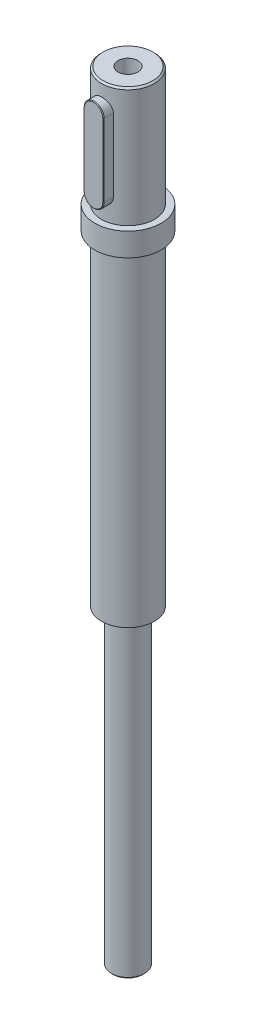
ISO-10303-21;
HEADER;
FILE_DESCRIPTION(('STEP AP214'),'2;1');
FILE_NAME('part.step','',(''),(''),'','','');
FILE_SCHEMA(('AUTOMOTIVE_DESIGN { 1 0 10303 214 1 1 1 1 }'));
ENDSEC;
DATA;
#1=APPLICATION_CONTEXT('core data for automotive mechanical design processes');
#2=APPLICATION_PROTOCOL_DEFINITION('international standard','automotive_design',2000,#1);
#3=PRODUCT_CONTEXT('',#1,'mechanical');
#4=PRODUCT('Part','Part','',(#3));
#5=PRODUCT_RELATED_PRODUCT_CATEGORY('part','',(#4));
#6=PRODUCT_DEFINITION_FORMATION('','',#4);
#7=PRODUCT_DEFINITION_CONTEXT('part definition',#1,'design');
#8=PRODUCT_DEFINITION('design','',#6,#7);
#9=PRODUCT_DEFINITION_SHAPE('','',#8);
#10=(LENGTH_UNIT() NAMED_UNIT(*) SI_UNIT(.MILLI.,.METRE.));
#11=(NAMED_UNIT(*) PLANE_ANGLE_UNIT() SI_UNIT($,.RADIAN.));
#12=(NAMED_UNIT(*) SI_UNIT($,.STERADIAN.) SOLID_ANGLE_UNIT());
#13=UNCERTAINTY_MEASURE_WITH_UNIT(LENGTH_MEASURE(1.E-05),#10,'distance_accuracy_value','');
#14=(GEOMETRIC_REPRESENTATION_CONTEXT(3) GLOBAL_UNCERTAINTY_ASSIGNED_CONTEXT((#13)) GLOBAL_UNIT_ASSIGNED_CONTEXT((#10,
#11,#12)) REPRESENTATION_CONTEXT('',''));
#15=CARTESIAN_POINT('',(0.,0.,0.));
#16=DIRECTION('',(0.,0.,1.));
#17=DIRECTION('',(1.,0.,0.));
#18=AXIS2_PLACEMENT_3D('',#15,#16,#17);
#19=CARTESIAN_POINT('',(0.,117.5,0.));
#20=DIRECTION('',(0.,-1.,0.));
#21=DIRECTION('',(0.,0.,-1.));
#22=AXIS2_PLACEMENT_3D('',#19,#20,#21);
#23=CYLINDRICAL_SURFACE('',#22,4.);
#24=CARTESIAN_POINT('',(0.,117.25,0.));
#25=DIRECTION('',(0.,1.,0.));
#26=DIRECTION('',(0.,0.,1.));
#27=AXIS2_PLACEMENT_3D('',#24,#25,#26);
#28=CIRCLE('',#27,4.);
#29=CARTESIAN_POINT('',(0.,117.25,4.));
#30=VERTEX_POINT('',#29);
#31=EDGE_CURVE('E155',#30,#30,#28,.F.);
#32=ORIENTED_EDGE('',*,*,#31,.T.);
#33=EDGE_LOOP('',(#32));
#34=FACE_BOUND('',#33,.T.);
#35=CARTESIAN_POINT('',(0.,99.5,0.));
#36=DIRECTION('',(0.,1.,0.));
#37=DIRECTION('',(0.,0.,1.));
#38=AXIS2_PLACEMENT_3D('',#35,#36,#37);
#39=CIRCLE('',#38,4.);
#40=CARTESIAN_POINT('',(0.,99.5,4.));
#41=VERTEX_POINT('',#40);
#42=EDGE_CURVE('E113',#41,#41,#39,.T.);
#43=ORIENTED_EDGE('',*,*,#42,.T.);
#44=EDGE_LOOP('',(#43));
#45=FACE_BOUND('',#44,.T.);
#46=CARTESIAN_POINT('',(-1.5,103.,3.70809924354783));
#47=CARTESIAN_POINT('',(-1.50000304106109,102.918992516279,3.70809640633806));
#48=CARTESIAN_POINT('',(-1.49341597549487,102.838005077496,3.71078260240986));
#49=CARTESIAN_POINT('',(-1.46736187895468,102.678471917087,3.72116159304967));
#50=CARTESIAN_POINT('',(-1.44789523373263,102.599926122405,3.72885423767112));
#51=CARTESIAN_POINT('',(-1.39689657610574,102.447624628386,3.748254802809));
#52=CARTESIAN_POINT('',(-1.36539347266348,102.373857943349,3.7599530956926));
#53=CARTESIAN_POINT('',(-1.29131856742698,102.232628103181,3.78603134206598));
#54=CARTESIAN_POINT('',(-1.24874344095039,102.165166849718,3.80041210067323));
#55=CARTESIAN_POINT('',(-1.15146661374163,102.035109688377,3.83103574665712));
#56=CARTESIAN_POINT('',(-1.09630381213307,101.972871470371,3.84733341923603));
#57=CARTESIAN_POINT('',(-0.976395839778934,101.858277185329,3.87949750628547));
#58=CARTESIAN_POINT('',(-0.911648630256685,101.805923226258,3.89536382814785));
#59=CARTESIAN_POINT('',(-0.771694655177602,101.710860487704,3.92552873936553));
#60=CARTESIAN_POINT('',(-0.696206947538028,101.668540525284,3.93975561223505));
#61=CARTESIAN_POINT('',(-0.538555771965246,101.597348827475,3.96438007973847));
#62=CARTESIAN_POINT('',(-0.456394630933535,101.568472428008,3.97477900217006));
#63=CARTESIAN_POINT('',(-0.291489341676831,101.526242104225,3.9901869710344));
#64=CARTESIAN_POINT('',(-0.208923197281596,101.51227237256,3.99540915214774));
#65=CARTESIAN_POINT('',(-0.0424643637947871,101.498278799055,4.0006401410794));
#66=CARTESIAN_POINT('',(0.041427885062831,101.498250422381,4.00065064414902));
#67=CARTESIAN_POINT('',(0.203743543064475,101.511781761465,3.99559265903894));
#68=CARTESIAN_POINT('',(0.2822321782669,101.524669297949,3.99077541996683));
#69=CARTESIAN_POINT('',(0.435839217984393,101.562535915226,3.97693274932263));
#70=CARTESIAN_POINT('',(0.510957383430299,101.587515852262,3.96790701975578));
#71=CARTESIAN_POINT('',(0.656989017303104,101.649170451676,3.94637769167531));
#72=CARTESIAN_POINT('',(0.727825392287309,101.686010005268,3.93382539470077));
#73=CARTESIAN_POINT('',(0.862486607957559,101.770192096929,3.90651310225279));
#74=CARTESIAN_POINT('',(0.926309176932322,101.817538023018,3.8917523951284));
#75=CARTESIAN_POINT('',(1.04909048680093,101.924627286283,3.86052529655816));
#76=CARTESIAN_POINT('',(1.10754614526348,101.98493391565,3.84400963763883));
#77=CARTESIAN_POINT('',(1.21370395569343,102.114592993322,3.81182460645722));
#78=CARTESIAN_POINT('',(1.261403406929,102.183947706587,3.79615544748847));
#79=CARTESIAN_POINT('',(1.34565611808151,102.331719467463,3.76712703500335));
#80=CARTESIAN_POINT('',(1.3819384785183,102.410303493686,3.75382677150277));
#81=CARTESIAN_POINT('',(1.44056464441501,102.573096225168,3.73172438629003));
#82=CARTESIAN_POINT('',(1.46291620605595,102.657301771594,3.72291976205783));
#83=CARTESIAN_POINT('',(1.49190191709668,102.823975962316,3.71139597222848));
#84=CARTESIAN_POINT('',(1.49933521158966,102.906284105536,3.70836785241537));
#85=CARTESIAN_POINT('',(1.50057885636272,103.071009356742,3.70786539525016));
#86=CARTESIAN_POINT('',(1.49439261093762,103.153426432352,3.71038967003987));
#87=CARTESIAN_POINT('',(1.46929733520157,103.311929922288,3.72039381629735));
#88=CARTESIAN_POINT('',(1.45100618334225,103.388131135765,3.72763276216449));
#89=CARTESIAN_POINT('',(1.40299774640638,103.53634794472,3.74596487046362));
#90=CARTESIAN_POINT('',(1.37327812034623,103.608362679168,3.75705882250173));
#91=CARTESIAN_POINT('',(1.30200292275278,103.749164438076,3.7823624311608));
#92=CARTESIAN_POINT('',(1.26004545177046,103.817729292137,3.79667328892065));
#93=CARTESIAN_POINT('',(1.16591317862479,103.947128981726,3.82662814294291));
#94=CARTESIAN_POINT('',(1.11373463696435,104.007960974625,3.84227262594077));
#95=CARTESIAN_POINT('',(0.996727340900941,104.124168373195,3.87433046553184));
#96=CARTESIAN_POINT('',(0.931306341491062,104.178953408769,3.89072969357028));
#97=CARTESIAN_POINT('',(0.791797471753148,104.276838367589,3.92149874963302));
#98=CARTESIAN_POINT('',(0.717709573322671,104.319938252946,3.93586857107664));
#99=CARTESIAN_POINT('',(0.563016329468475,104.3929460562,3.96094985704552));
#100=CARTESIAN_POINT('',(0.482434433064626,104.422899123793,3.9716738133801));
#101=CARTESIAN_POINT('',(0.316881887523253,104.46865641385,3.98829436712571));
#102=CARTESIAN_POINT('',(0.23191332072359,104.484467285422,3.99419323299413));
#103=CARTESIAN_POINT('',(0.0653355852738132,104.500774402755,4.00028407317073));
#104=CARTESIAN_POINT('',(-0.0161807680608467,104.502109483059,4.00078860953764));
#105=CARTESIAN_POINT('',(-0.178226786412424,104.491584840555,3.99684889809223));
#106=CARTESIAN_POINT('',(-0.258756569245257,104.479726709114,3.9924052471313));
#107=CARTESIAN_POINT('',(-0.414548248377124,104.443741148506,3.97921089603771));
#108=CARTESIAN_POINT('',(-0.489890731068831,104.419920094122,3.97056791378017));
#109=CARTESIAN_POINT('',(-0.635515473006387,104.360989986616,3.9498778362099));
#110=CARTESIAN_POINT('',(-0.705796771275542,104.325878796695,3.93783009655664));
#111=CARTESIAN_POINT('',(-0.842540176994411,104.243686056495,3.91090618300074));
#112=CARTESIAN_POINT('',(-0.908717548846845,104.196163359486,3.89593240108829));
#113=CARTESIAN_POINT('',(-1.03241734752336,104.091192169812,3.86499507694844));
#114=CARTESIAN_POINT('',(-1.0899366712559,104.033740134192,3.84903118274027));
#115=CARTESIAN_POINT('',(-1.19781214236196,103.906935868355,3.81688129739175));
#116=CARTESIAN_POINT('',(-1.24762999816025,103.837115597846,3.8007280534916));
#117=CARTESIAN_POINT('',(-1.33484709556843,103.689584130427,3.77098325003638));
#118=CARTESIAN_POINT('',(-1.37224504878156,103.611872115947,3.75739195631217));
#119=CARTESIAN_POINT('',(-1.4346588697426,103.447044319025,3.73402269853266));
#120=CARTESIAN_POINT('',(-1.45906002899523,103.359665633488,3.7244380329086));
#121=CARTESIAN_POINT('',(-1.49172356722079,103.181514728044,3.71147994336315));
#122=CARTESIAN_POINT('',(-1.49999659339571,103.09074478729,3.70810242179736));
#123=CARTESIAN_POINT('',(-1.5,103.,3.70809924354783));
#124=B_SPLINE_CURVE_WITH_KNOTS('',3,(#46,#47,#48,#49,#50,#51,#52,#53,#54,#55,#56,#57,#58,#59,
#60,#61,#62,#63,#64,#65,#66,#67,#68,#69,#70,#71,#72,#73,#74,#75,#76,#77,#78,#79,#80,#81,#82,#83,
#84,#85,#86,#87,#88,#89,#90,#91,#92,#93,#94,#95,#96,#97,#98,#99,#100,#101,#102,#103,#104,#105,
#106,#107,#108,#109,#110,#111,#112,#113,#114,#115,#116,#117,#118,#119,#120,#121,#122,#123),
.UNSPECIFIED.,.T.,.F.,(4,2,2,2,2,2,2,2,2,2,2,2,2,2,2,2,2,2,2,2,2,2,2,2,2,2,2,2,2,2,2,2,2,2,2,2,
2,2,4),(0.,0.242684541416171,0.485361814598854,0.727459856757025,0.969630679682926,
1.22274652401127,1.47591628822983,1.73770072136422,1.99939426381331,2.24980018489679,
2.50012465404857,2.73806472803195,2.97602165263335,3.21744131210668,3.45893893628976,
3.71456675065874,3.97025867827334,4.23162592252965,4.49284751635474,4.73965657740485,
4.98640395388884,5.22143845928199,5.45652113429525,5.70041561005822,5.94439948466355,
6.20385016993624,6.46330169650178,6.72185508890169,6.98028685560127,7.22365720549936,
7.4669982031948,7.7044027400389,7.94185223512831,8.18928323676987,8.43680270894965,
8.69738599542079,8.95799630544242,9.23003178870927,9.50188762323053),.UNSPECIFIED.);
#125=CARTESIAN_POINT('',(-1.5,103.,3.70809924354783));
#126=VERTEX_POINT('',#125);
#127=CARTESIAN_POINT('',(1.5,103.,3.70809924354783));
#128=VERTEX_POINT('',#127);
#129=EDGE_CURVE('E94',#126,#128,#124,.T.);
#130=ORIENTED_EDGE('',*,*,#129,.F.);
#131=DIRECTION('',(0.,-1.,0.));
#132=VECTOR('',#131,1.);
#133=CARTESIAN_POINT('',(-1.5,117.5,3.70809924354783));
#134=LINE('',#133,#132);
#135=CARTESIAN_POINT('',(-1.5,114.,3.70809924354783));
#136=VERTEX_POINT('',#135);
#137=EDGE_CURVE('E104',#136,#126,#134,.T.);
#138=ORIENTED_EDGE('',*,*,#137,.F.);
#139=CARTESIAN_POINT('',(-1.5,114.,3.70809924354783));
#140=CARTESIAN_POINT('',(-1.50000304106109,113.918992516279,3.70809640633806));
#141=CARTESIAN_POINT('',(-1.49341597549487,113.838005077496,3.71078260240986));
#142=CARTESIAN_POINT('',(-1.46736187895468,113.678471917087,3.72116159304967));
#143=CARTESIAN_POINT('',(-1.44789523373263,113.599926122405,3.72885423767112));
#144=CARTESIAN_POINT('',(-1.39689657610574,113.447624628386,3.748254802809));
#145=CARTESIAN_POINT('',(-1.36539347266348,113.373857943349,3.7599530956926));
#146=CARTESIAN_POINT('',(-1.29131856742698,113.232628103181,3.78603134206598));
#147=CARTESIAN_POINT('',(-1.24874344095039,113.165166849718,3.80041210067323));
#148=CARTESIAN_POINT('',(-1.15146661374163,113.035109688377,3.83103574665712));
#149=CARTESIAN_POINT('',(-1.09630381213307,112.972871470371,3.84733341923603));
#150=CARTESIAN_POINT('',(-0.97639583977893,112.858277185329,3.87949750628547));
#151=CARTESIAN_POINT('',(-0.911648630256684,112.805923226258,3.89536382814785));
#152=CARTESIAN_POINT('',(-0.771694655177605,112.710860487704,3.92552873936553));
#153=CARTESIAN_POINT('',(-0.696206947538032,112.668540525284,3.93975561223505));
#154=CARTESIAN_POINT('',(-0.538555771965248,112.597348827475,3.96438007973848));
#155=CARTESIAN_POINT('',(-0.456394630933533,112.568472428008,3.97477900217006));
#156=CARTESIAN_POINT('',(-0.291489341676828,112.526242104225,3.9901869710344));
#157=CARTESIAN_POINT('',(-0.208923197281593,112.51227237256,3.99540915214774));
#158=CARTESIAN_POINT('',(-0.042464363794786,112.498278799055,4.0006401410794));
#159=CARTESIAN_POINT('',(0.0414278850628317,112.498250422381,4.00065064414902));
#160=CARTESIAN_POINT('',(0.203743543064474,112.511781761465,3.99559265903894));
#161=CARTESIAN_POINT('',(0.282232178266899,112.524669297949,3.99077541996683));
#162=CARTESIAN_POINT('',(0.435839217984391,112.562535915226,3.97693274932263));
#163=CARTESIAN_POINT('',(0.510957383430298,112.587515852262,3.96790701975578));
#164=CARTESIAN_POINT('',(0.656989017303105,112.649170451676,3.94637769167531));
#165=CARTESIAN_POINT('',(0.72782539228731,112.686010005268,3.93382539470077));
#166=CARTESIAN_POINT('',(0.86248660795756,112.770192096929,3.90651310225279));
#167=CARTESIAN_POINT('',(0.926309176932322,112.817538023018,3.8917523951284));
#168=CARTESIAN_POINT('',(1.04909048680094,112.924627286283,3.86052529655816));
#169=CARTESIAN_POINT('',(1.10754614526348,112.98493391565,3.84400963763883));
#170=CARTESIAN_POINT('',(1.21370395569343,113.114592993322,3.81182460645722));
#171=CARTESIAN_POINT('',(1.261403406929,113.183947706587,3.79615544748847));
#172=CARTESIAN_POINT('',(1.34565611808151,113.331719467463,3.76712703500335));
#173=CARTESIAN_POINT('',(1.38193847851831,113.410303493686,3.75382677150277));
#174=CARTESIAN_POINT('',(1.44056464441501,113.573096225168,3.73172438629002));
#175=CARTESIAN_POINT('',(1.46291620605595,113.657301771594,3.72291976205783));
#176=CARTESIAN_POINT('',(1.49190191709668,113.823975962316,3.71139597222848));
#177=CARTESIAN_POINT('',(1.49933521158966,113.906284105536,3.70836785241537));
#178=CARTESIAN_POINT('',(1.50057885636272,114.071009356742,3.70786539525016));
#179=CARTESIAN_POINT('',(1.49439261093762,114.153426432352,3.71038967003987));
#180=CARTESIAN_POINT('',(1.46929733520157,114.311929922288,3.72039381629735));
#181=CARTESIAN_POINT('',(1.45100618334225,114.388131135765,3.72763276216449));
#182=CARTESIAN_POINT('',(1.40299774640638,114.53634794472,3.74596487046361));
#183=CARTESIAN_POINT('',(1.37327812034623,114.608362679168,3.75705882250173));
#184=CARTESIAN_POINT('',(1.30200292275278,114.749164438076,3.7823624311608));
#185=CARTESIAN_POINT('',(1.26004545177047,114.817729292137,3.79667328892065));
#186=CARTESIAN_POINT('',(1.1659131786248,114.947128981726,3.82662814294291));
#187=CARTESIAN_POINT('',(1.11373463696435,115.007960974625,3.84227262594077));
#188=CARTESIAN_POINT('',(0.996727340900941,115.124168373195,3.87433046553184));
#189=CARTESIAN_POINT('',(0.931306341491062,115.178953408769,3.89072969357027));
#190=CARTESIAN_POINT('',(0.79179747175315,115.276838367589,3.92149874963302));
#191=CARTESIAN_POINT('',(0.717709573322673,115.319938252946,3.93586857107664));
#192=CARTESIAN_POINT('',(0.563016329468476,115.3929460562,3.96094985704552));
#193=CARTESIAN_POINT('',(0.482434433064624,115.422899123793,3.9716738133801));
#194=CARTESIAN_POINT('',(0.316881887523252,115.46865641385,3.98829436712571));
#195=CARTESIAN_POINT('',(0.231913320723591,115.484467285422,3.99419323299412));
#196=CARTESIAN_POINT('',(0.0653355852738152,115.500774402755,4.00028407317073));
#197=CARTESIAN_POINT('',(-0.0161807680608452,115.502109483059,4.00078860953764));
#198=CARTESIAN_POINT('',(-0.178226786412423,115.491584840555,3.99684889809223));
#199=CARTESIAN_POINT('',(-0.258756569245257,115.479726709114,3.9924052471313));
#200=CARTESIAN_POINT('',(-0.414548248377126,115.443741148506,3.97921089603771));
#201=CARTESIAN_POINT('',(-0.489890731068834,115.419920094122,3.97056791378017));
#202=CARTESIAN_POINT('',(-0.635515473006389,115.360989986616,3.9498778362099));
#203=CARTESIAN_POINT('',(-0.705796771275541,115.325878796695,3.93783009655664));
#204=CARTESIAN_POINT('',(-0.842540176994412,115.243686056495,3.91090618300074));
#205=CARTESIAN_POINT('',(-0.908717548846851,115.196163359486,3.89593240108828));
#206=CARTESIAN_POINT('',(-1.03241734752336,115.091192169812,3.86499507694844));
#207=CARTESIAN_POINT('',(-1.0899366712559,115.033740134192,3.84903118274027));
#208=CARTESIAN_POINT('',(-1.19781214236195,114.906935868355,3.81688129739175));
#209=CARTESIAN_POINT('',(-1.24762999816025,114.837115597846,3.8007280534916));
#210=CARTESIAN_POINT('',(-1.33484709556843,114.689584130427,3.77098325003638));
#211=CARTESIAN_POINT('',(-1.37224504878156,114.611872115947,3.75739195631217));
#212=CARTESIAN_POINT('',(-1.4346588697426,114.447044319025,3.73402269853266));
#213=CARTESIAN_POINT('',(-1.45906002899522,114.359665633488,3.7244380329086));
#214=CARTESIAN_POINT('',(-1.49172356722079,114.181514728044,3.71147994336315));
#215=CARTESIAN_POINT('',(-1.49999659339571,114.09074478729,3.70810242179736));
#216=CARTESIAN_POINT('',(-1.5,114.,3.70809924354783));
#217=B_SPLINE_CURVE_WITH_KNOTS('',3,(#139,#140,#141,#142,#143,#144,#145,#146,#147,#148,#149,
#150,#151,#152,#153,#154,#155,#156,#157,#158,#159,#160,#161,#162,#163,#164,#165,#166,#167,#168,
#169,#170,#171,#172,#173,#174,#175,#176,#177,#178,#179,#180,#181,#182,#183,#184,#185,#186,#187,
#188,#189,#190,#191,#192,#193,#194,#195,#196,#197,#198,#199,#200,#201,#202,#203,#204,#205,#206,
#207,#208,#209,#210,#211,#212,#213,#214,#215,#216),.UNSPECIFIED.,.T.,.F.,(4,2,2,2,2,2,2,2,2,2,2,
2,2,2,2,2,2,2,2,2,2,2,2,2,2,2,2,2,2,2,2,2,2,2,2,2,2,2,4),(0.,0.242684541416171,
0.485361814598854,0.727459856757025,0.969630679682926,1.22274652401127,1.47591628822982,
1.73770072136421,1.99939426381331,2.24980018489679,2.50012465404857,2.73806472803194,
2.97602165263335,3.21744131210668,3.45893893628976,3.71456675065875,3.97025867827335,
4.23162592252966,4.49284751635474,4.73965657740485,4.98640395388885,5.22143845928198,
5.45652113429526,5.70041561005822,5.94439948466355,6.20385016993625,6.46330169650178,
6.72185508890169,6.98028685560128,7.22365720549937,7.4669982031948,7.70440274003891,
7.94185223512831,8.18928323676988,8.43680270894966,8.69738599542078,8.95799630544242,
9.23003178870925,9.50188762323054),.UNSPECIFIED.);
#218=CARTESIAN_POINT('',(1.5,114.,3.70809924354783));
#219=VERTEX_POINT('',#218);
#220=EDGE_CURVE('E112',#219,#136,#217,.T.);
#221=ORIENTED_EDGE('',*,*,#220,.F.);
#222=DIRECTION('',(0.,-1.,0.));
#223=VECTOR('',#222,1.);
#224=CARTESIAN_POINT('',(1.5,117.5,3.70809924354783));
#225=LINE('',#224,#223);
#226=EDGE_CURVE('E107',#128,#219,#225,.F.);
#227=ORIENTED_EDGE('',*,*,#226,.F.);
#228=EDGE_LOOP('',(#130,#138,#221,#227));
#229=FACE_BOUND('',#228,.T.);
#230=ADVANCED_FACE('F39',(#34,#45,#229),#23,.T.);
#231=CARTESIAN_POINT('',(0.,47.,0.));
#232=DIRECTION('',(0.,-1.,0.));
#233=DIRECTION('',(0.,0.,-1.));
#234=AXIS2_PLACEMENT_3D('',#231,#232,#233);
#235=CYLINDRICAL_SURFACE('',#234,2.5);
#236=CARTESIAN_POINT('',(0.,0.250000000000014,0.));
#237=DIRECTION('',(0.,1.,0.));
#238=DIRECTION('',(0.,0.,1.));
#239=AXIS2_PLACEMENT_3D('',#236,#237,#238);
#240=CIRCLE('',#239,2.5);
#241=CARTESIAN_POINT('',(0.,0.250000000000014,2.5));
#242=VERTEX_POINT('',#241);
#243=EDGE_CURVE('E108',#242,#242,#240,.T.);
#244=ORIENTED_EDGE('',*,*,#243,.T.);
#245=EDGE_LOOP('',(#244));
#246=FACE_BOUND('',#245,.T.);
#247=CARTESIAN_POINT('',(0.,47.,0.));
#248=DIRECTION('',(0.,1.,0.));
#249=DIRECTION('',(0.,0.,1.));
#250=AXIS2_PLACEMENT_3D('',#247,#248,#249);
#251=CIRCLE('',#250,2.5);
#252=CARTESIAN_POINT('',(0.,47.,2.5));
#253=VERTEX_POINT('',#252);
#254=EDGE_CURVE('E117',#253,#253,#251,.T.);
#255=ORIENTED_EDGE('',*,*,#254,.F.);
#256=EDGE_LOOP('',(#255));
#257=FACE_BOUND('',#256,.T.);
#258=ADVANCED_FACE('F211',(#246,#257),#235,.T.);
#259=CARTESIAN_POINT('',(0.,0.,0.));
#260=DIRECTION('',(0.,1.,0.));
#261=DIRECTION('',(0.,0.,1.));
#262=AXIS2_PLACEMENT_3D('',#259,#260,#261);
#263=PLANE('',#262);
#264=CARTESIAN_POINT('',(0.,0.,0.));
#265=DIRECTION('',(0.,1.,0.));
#266=DIRECTION('',(0.,0.,1.));
#267=AXIS2_PLACEMENT_3D('',#264,#265,#266);
#268=CIRCLE('',#267,2.24999999999999);
#269=CARTESIAN_POINT('',(0.,0.,2.24999999999999));
#270=VERTEX_POINT('',#269);
#271=EDGE_CURVE('E149',#270,#270,#268,.F.);
#272=ORIENTED_EDGE('',*,*,#271,.T.);
#273=EDGE_LOOP('',(#272));
#274=FACE_BOUND('',#273,.T.);
#275=ADVANCED_FACE('F216',(#274),#263,.F.);
#276=CARTESIAN_POINT('',(0.,96.,0.));
#277=DIRECTION('',(0.,-1.,0.));
#278=DIRECTION('',(0.,0.,-1.));
#279=AXIS2_PLACEMENT_3D('',#276,#277,#278);
#280=CYLINDRICAL_SURFACE('',#279,4.);
#281=CARTESIAN_POINT('',(0.,96.,0.));
#282=DIRECTION('',(0.,1.,0.));
#283=DIRECTION('',(0.,0.,1.));
#284=AXIS2_PLACEMENT_3D('',#281,#282,#283);
#285=CIRCLE('',#284,4.);
#286=CARTESIAN_POINT('',(0.,96.,4.));
#287=VERTEX_POINT('',#286);
#288=EDGE_CURVE('E236',#287,#287,#285,.T.);
#289=ORIENTED_EDGE('',*,*,#288,.F.);
#290=EDGE_LOOP('',(#289));
#291=FACE_BOUND('',#290,.T.);
#292=CARTESIAN_POINT('',(0.,47.,0.));
#293=DIRECTION('',(0.,1.,0.));
#294=DIRECTION('',(0.,0.,1.));
#295=AXIS2_PLACEMENT_3D('',#292,#293,#294);
#296=CIRCLE('',#295,4.);
#297=CARTESIAN_POINT('',(0.,47.,4.));
#298=VERTEX_POINT('',#297);
#299=EDGE_CURVE('E232',#298,#298,#296,.T.);
#300=ORIENTED_EDGE('',*,*,#299,.T.);
#301=EDGE_LOOP('',(#300));
#302=FACE_BOUND('',#301,.T.);
#303=ADVANCED_FACE('F252',(#291,#302),#280,.T.);
#304=CARTESIAN_POINT('',(0.,47.,0.));
#305=DIRECTION('',(0.,1.,0.));
#306=DIRECTION('',(0.,0.,1.));
#307=AXIS2_PLACEMENT_3D('',#304,#305,#306);
#308=PLANE('',#307);
#309=ORIENTED_EDGE('',*,*,#254,.T.);
#310=EDGE_LOOP('',(#309));
#311=FACE_BOUND('',#310,.T.);
#312=ORIENTED_EDGE('',*,*,#299,.F.);
#313=EDGE_LOOP('',(#312));
#314=FACE_BOUND('',#313,.T.);
#315=ADVANCED_FACE('F248',(#311,#314),#308,.F.);
#316=CARTESIAN_POINT('',(0.,99.5,0.));
#317=DIRECTION('',(0.,-1.,0.));
#318=DIRECTION('',(0.,0.,-1.));
#319=AXIS2_PLACEMENT_3D('',#316,#317,#318);
#320=CYLINDRICAL_SURFACE('',#319,5.);
#321=CARTESIAN_POINT('',(0.,99.5,0.));
#322=DIRECTION('',(0.,1.,0.));
#323=DIRECTION('',(0.,0.,1.));
#324=AXIS2_PLACEMENT_3D('',#321,#322,#323);
#325=CIRCLE('',#324,5.);
#326=CARTESIAN_POINT('',(0.,99.5,5.));
#327=VERTEX_POINT('',#326);
#328=EDGE_CURVE('E230',#327,#327,#325,.T.);
#329=ORIENTED_EDGE('',*,*,#328,.F.);
#330=EDGE_LOOP('',(#329));
#331=FACE_BOUND('',#330,.T.);
#332=CARTESIAN_POINT('',(0.,96.,0.));
#333=DIRECTION('',(0.,1.,0.));
#334=DIRECTION('',(0.,0.,1.));
#335=AXIS2_PLACEMENT_3D('',#332,#333,#334);
#336=CIRCLE('',#335,5.);
#337=CARTESIAN_POINT('',(0.,96.,5.));
#338=VERTEX_POINT('',#337);
#339=EDGE_CURVE('E233',#338,#338,#336,.T.);
#340=ORIENTED_EDGE('',*,*,#339,.T.);
#341=EDGE_LOOP('',(#340));
#342=FACE_BOUND('',#341,.T.);
#343=ADVANCED_FACE('F227',(#331,#342),#320,.T.);
#344=CARTESIAN_POINT('',(0.,99.5,0.));
#345=DIRECTION('',(0.,1.,0.));
#346=DIRECTION('',(0.,0.,1.));
#347=AXIS2_PLACEMENT_3D('',#344,#345,#346);
#348=PLANE('',#347);
#349=ORIENTED_EDGE('',*,*,#42,.F.);
#350=EDGE_LOOP('',(#349));
#351=FACE_BOUND('',#350,.T.);
#352=ORIENTED_EDGE('',*,*,#328,.T.);
#353=EDGE_LOOP('',(#352));
#354=FACE_BOUND('',#353,.T.);
#355=ADVANCED_FACE('F223',(#351,#354),#348,.T.);
#356=CARTESIAN_POINT('',(0.,96.,0.));
#357=DIRECTION('',(0.,1.,0.));
#358=DIRECTION('',(0.,0.,1.));
#359=AXIS2_PLACEMENT_3D('',#356,#357,#358);
#360=PLANE('',#359);
#361=ORIENTED_EDGE('',*,*,#288,.T.);
#362=EDGE_LOOP('',(#361));
#363=FACE_BOUND('',#362,.T.);
#364=ORIENTED_EDGE('',*,*,#339,.F.);
#365=EDGE_LOOP('',(#364));
#366=FACE_BOUND('',#365,.T.);
#367=ADVANCED_FACE('F226',(#363,#366),#360,.F.);
#368=CARTESIAN_POINT('',(0.,117.5,0.));
#369=DIRECTION('',(0.,1.,0.));
#370=DIRECTION('',(0.,0.,1.));
#371=AXIS2_PLACEMENT_3D('',#368,#369,#370);
#372=PLANE('',#371);
#373=CARTESIAN_POINT('',(0.,117.5,0.));
#374=DIRECTION('',(0.,1.,0.));
#375=DIRECTION('',(0.,0.,1.));
#376=AXIS2_PLACEMENT_3D('',#373,#374,#375);
#377=CIRCLE('',#376,1.5);
#378=CARTESIAN_POINT('',(0.,117.5,1.5));
#379=VERTEX_POINT('',#378);
#380=EDGE_CURVE('E416',#379,#379,#377,.T.);
#381=ORIENTED_EDGE('',*,*,#380,.F.);
#382=EDGE_LOOP('',(#381));
#383=FACE_BOUND('',#382,.T.);
#384=CARTESIAN_POINT('',(0.,117.5,0.));
#385=DIRECTION('',(0.,1.,0.));
#386=DIRECTION('',(0.,0.,1.));
#387=AXIS2_PLACEMENT_3D('',#384,#385,#386);
#388=CIRCLE('',#387,3.75);
#389=CARTESIAN_POINT('',(0.,117.5,3.75));
#390=VERTEX_POINT('',#389);
#391=EDGE_CURVE('E152',#390,#390,#388,.T.);
#392=ORIENTED_EDGE('',*,*,#391,.T.);
#393=EDGE_LOOP('',(#392));
#394=FACE_BOUND('',#393,.T.);
#395=ADVANCED_FACE('F142',(#383,#394),#372,.T.);
#396=CARTESIAN_POINT('',(0.,103.,5.2));
#397=DIRECTION('',(0.,0.,-1.));
#398=DIRECTION('',(-1.,0.,0.));
#399=AXIS2_PLACEMENT_3D('',#396,#397,#398);
#400=CYLINDRICAL_SURFACE('',#399,1.5);
#401=DIRECTION('',(0.,0.,-1.));
#402=VECTOR('',#401,1.);
#403=CARTESIAN_POINT('',(1.5,103.,5.2));
#404=LINE('',#403,#402);
#405=CARTESIAN_POINT('',(1.5,103.,5.1));
#406=VERTEX_POINT('',#405);
#407=EDGE_CURVE('E238',#406,#128,#404,.T.);
#408=ORIENTED_EDGE('',*,*,#407,.F.);
#409=CARTESIAN_POINT('',(0.,103.,5.1));
#410=DIRECTION('',(0.,0.,1.));
#411=DIRECTION('',(1.,0.,0.));
#412=AXIS2_PLACEMENT_3D('',#409,#410,#411);
#413=CIRCLE('',#412,1.5);
#414=CARTESIAN_POINT('',(-1.5,103.,5.1));
#415=VERTEX_POINT('',#414);
#416=EDGE_CURVE('E49',#406,#415,#413,.F.);
#417=ORIENTED_EDGE('',*,*,#416,.T.);
#418=DIRECTION('',(0.,0.,-1.));
#419=VECTOR('',#418,1.);
#420=CARTESIAN_POINT('',(-1.5,103.,5.2));
#421=LINE('',#420,#419);
#422=EDGE_CURVE('E91',#415,#126,#421,.T.);
#423=ORIENTED_EDGE('',*,*,#422,.T.);
#424=ORIENTED_EDGE('',*,*,#129,.T.);
#425=EDGE_LOOP('',(#408,#417,#423,#424));
#426=FACE_BOUND('',#425,.T.);
#427=ADVANCED_FACE('F93',(#426),#400,.T.);
#428=CARTESIAN_POINT('',(1.5,103.,5.2));
#429=DIRECTION('',(-1.,0.,0.));
#430=DIRECTION('',(0.,-1.,0.));
#431=AXIS2_PLACEMENT_3D('',#428,#429,#430);
#432=PLANE('',#431);
#433=DIRECTION('',(0.,0.,-1.));
#434=VECTOR('',#433,1.);
#435=CARTESIAN_POINT('',(1.5,114.,5.2));
#436=LINE('',#435,#434);
#437=CARTESIAN_POINT('',(1.5,114.,5.1));
#438=VERTEX_POINT('',#437);
#439=EDGE_CURVE('E193',#438,#219,#436,.T.);
#440=ORIENTED_EDGE('',*,*,#439,.F.);
#441=DIRECTION('',(0.,-1.,0.));
#442=VECTOR('',#441,1.);
#443=CARTESIAN_POINT('',(1.5,103.,5.1));
#444=LINE('',#443,#442);
#445=EDGE_CURVE('E11',#438,#406,#444,.T.);
#446=ORIENTED_EDGE('',*,*,#445,.T.);
#447=ORIENTED_EDGE('',*,*,#407,.T.);
#448=ORIENTED_EDGE('',*,*,#226,.T.);
#449=EDGE_LOOP('',(#440,#446,#447,#448));
#450=FACE_BOUND('',#449,.T.);
#451=ADVANCED_FACE('F135',(#450),#432,.F.);
#452=CARTESIAN_POINT('',(0.,114.,5.2));
#453=DIRECTION('',(0.,0.,-1.));
#454=DIRECTION('',(-1.,0.,0.));
#455=AXIS2_PLACEMENT_3D('',#452,#453,#454);
#456=CYLINDRICAL_SURFACE('',#455,1.5);
#457=DIRECTION('',(0.,0.,-1.));
#458=VECTOR('',#457,1.);
#459=CARTESIAN_POINT('',(-1.5,114.,5.2));
#460=LINE('',#459,#458);
#461=CARTESIAN_POINT('',(-1.5,114.,5.1));
#462=VERTEX_POINT('',#461);
#463=EDGE_CURVE('E98',#462,#136,#460,.T.);
#464=ORIENTED_EDGE('',*,*,#463,.F.);
#465=CARTESIAN_POINT('',(0.,114.,5.1));
#466=DIRECTION('',(0.,0.,1.));
#467=DIRECTION('',(1.,0.,0.));
#468=AXIS2_PLACEMENT_3D('',#465,#466,#467);
#469=CIRCLE('',#468,1.5);
#470=EDGE_CURVE('E167',#462,#438,#469,.F.);
#471=ORIENTED_EDGE('',*,*,#470,.T.);
#472=ORIENTED_EDGE('',*,*,#439,.T.);
#473=ORIENTED_EDGE('',*,*,#220,.T.);
#474=EDGE_LOOP('',(#464,#471,#472,#473));
#475=FACE_BOUND('',#474,.T.);
#476=ADVANCED_FACE('F130',(#475),#456,.T.);
#477=CARTESIAN_POINT('',(-1.5,103.,5.2));
#478=DIRECTION('',(1.,0.,0.));
#479=DIRECTION('',(0.,1.,0.));
#480=AXIS2_PLACEMENT_3D('',#477,#478,#479);
#481=PLANE('',#480);
#482=ORIENTED_EDGE('',*,*,#422,.F.);
#483=DIRECTION('',(0.,1.,0.));
#484=VECTOR('',#483,1.);
#485=CARTESIAN_POINT('',(-1.5,114.,5.1));
#486=LINE('',#485,#484);
#487=EDGE_CURVE('E170',#415,#462,#486,.T.);
#488=ORIENTED_EDGE('',*,*,#487,.T.);
#489=ORIENTED_EDGE('',*,*,#463,.T.);
#490=ORIENTED_EDGE('',*,*,#137,.T.);
#491=EDGE_LOOP('',(#482,#488,#489,#490));
#492=FACE_BOUND('',#491,.T.);
#493=ADVANCED_FACE('F110',(#492),#481,.F.);
#494=CARTESIAN_POINT('',(0.,103.,5.2));
#495=DIRECTION('',(0.,0.,1.));
#496=DIRECTION('',(1.,0.,0.));
#497=AXIS2_PLACEMENT_3D('',#494,#495,#496);
#498=PLANE('',#497);
#499=DIRECTION('',(0.,1.,0.));
#500=VECTOR('',#499,1.);
#501=CARTESIAN_POINT('',(1.4,114.,5.2));
#502=LINE('',#501,#500);
#503=CARTESIAN_POINT('',(1.4,103.,5.2));
#504=VERTEX_POINT('',#503);
#505=CARTESIAN_POINT('',(1.4,114.,5.2));
#506=VERTEX_POINT('',#505);
#507=EDGE_CURVE('E158',#504,#506,#502,.T.);
#508=ORIENTED_EDGE('',*,*,#507,.T.);
#509=CARTESIAN_POINT('',(0.,114.,5.2));
#510=DIRECTION('',(0.,0.,1.));
#511=DIRECTION('',(1.,0.,0.));
#512=AXIS2_PLACEMENT_3D('',#509,#510,#511);
#513=CIRCLE('',#512,1.4);
#514=CARTESIAN_POINT('',(-1.4,114.,5.2));
#515=VERTEX_POINT('',#514);
#516=EDGE_CURVE('E164',#506,#515,#513,.T.);
#517=ORIENTED_EDGE('',*,*,#516,.T.);
#518=DIRECTION('',(0.,-1.,0.));
#519=VECTOR('',#518,1.);
#520=CARTESIAN_POINT('',(-1.4,103.,5.2));
#521=LINE('',#520,#519);
#522=CARTESIAN_POINT('',(-1.4,103.,5.2));
#523=VERTEX_POINT('',#522);
#524=EDGE_CURVE('E162',#515,#523,#521,.T.);
#525=ORIENTED_EDGE('',*,*,#524,.T.);
#526=CARTESIAN_POINT('',(0.,103.,5.2));
#527=DIRECTION('',(0.,0.,1.));
#528=DIRECTION('',(1.,0.,0.));
#529=AXIS2_PLACEMENT_3D('',#526,#527,#528);
#530=CIRCLE('',#529,1.4);
#531=EDGE_CURVE('E160',#523,#504,#530,.T.);
#532=ORIENTED_EDGE('',*,*,#531,.T.);
#533=EDGE_LOOP('',(#508,#517,#525,#532));
#534=FACE_BOUND('',#533,.T.);
#535=ADVANCED_FACE('F199',(#534),#498,.T.);
#536=CARTESIAN_POINT('',(0.,0.250000000000014,0.));
#537=DIRECTION('',(0.,1.,0.));
#538=DIRECTION('',(0.,0.,1.));
#539=AXIS2_PLACEMENT_3D('',#536,#537,#538);
#540=CONICAL_SURFACE('',#539,2.5,0.785398163397443);
#541=ORIENTED_EDGE('',*,*,#271,.F.);
#542=EDGE_LOOP('',(#541));
#543=FACE_BOUND('',#542,.T.);
#544=ORIENTED_EDGE('',*,*,#243,.F.);
#545=EDGE_LOOP('',(#544));
#546=FACE_BOUND('',#545,.T.);
#547=ADVANCED_FACE('F201',(#543,#546),#540,.T.);
#548=CARTESIAN_POINT('',(0.,117.5,0.));
#549=DIRECTION('',(0.,-1.,0.));
#550=DIRECTION('',(0.,0.,-1.));
#551=AXIS2_PLACEMENT_3D('',#548,#549,#550);
#552=CONICAL_SURFACE('',#551,3.75,0.785398163397441);
#553=ORIENTED_EDGE('',*,*,#31,.F.);
#554=EDGE_LOOP('',(#553));
#555=FACE_BOUND('',#554,.T.);
#556=ORIENTED_EDGE('',*,*,#391,.F.);
#557=EDGE_LOOP('',(#556));
#558=FACE_BOUND('',#557,.T.);
#559=ADVANCED_FACE('F206',(#555,#558),#552,.T.);
#560=CARTESIAN_POINT('',(0.,103.,5.2));
#561=DIRECTION('',(0.,0.,-1.));
#562=DIRECTION('',(-1.,0.,0.));
#563=AXIS2_PLACEMENT_3D('',#560,#561,#562);
#564=CONICAL_SURFACE('',#563,1.4,0.785398163397448);
#565=DIRECTION('',(0.707106781186548,0.,0.707106781186548));
#566=VECTOR('',#565,1.);
#567=CARTESIAN_POINT('',(-1.5,103.,5.1));
#568=LINE('',#567,#566);
#569=EDGE_CURVE('E177',#415,#523,#568,.T.);
#570=ORIENTED_EDGE('',*,*,#569,.F.);
#571=ORIENTED_EDGE('',*,*,#416,.F.);
#572=DIRECTION('',(0.707106781186548,0.,-0.707106781186548));
#573=VECTOR('',#572,1.);
#574=CARTESIAN_POINT('',(1.4,103.,5.2));
#575=LINE('',#574,#573);
#576=EDGE_CURVE('E44',#504,#406,#575,.T.);
#577=ORIENTED_EDGE('',*,*,#576,.F.);
#578=ORIENTED_EDGE('',*,*,#531,.F.);
#579=EDGE_LOOP('',(#570,#571,#577,#578));
#580=FACE_BOUND('',#579,.T.);
#581=ADVANCED_FACE('F42',(#580),#564,.T.);
#582=CARTESIAN_POINT('',(1.4,103.,5.2));
#583=DIRECTION('',(0.707106781186548,0.,0.707106781186548));
#584=DIRECTION('',(0.,-1.,0.));
#585=AXIS2_PLACEMENT_3D('',#582,#583,#584);
#586=PLANE('',#585);
#587=ORIENTED_EDGE('',*,*,#576,.T.);
#588=ORIENTED_EDGE('',*,*,#445,.F.);
#589=DIRECTION('',(0.707106781186548,0.,-0.707106781186548));
#590=VECTOR('',#589,1.);
#591=CARTESIAN_POINT('',(1.4,114.,5.2));
#592=LINE('',#591,#590);
#593=EDGE_CURVE('E175',#506,#438,#592,.T.);
#594=ORIENTED_EDGE('',*,*,#593,.F.);
#595=ORIENTED_EDGE('',*,*,#507,.F.);
#596=EDGE_LOOP('',(#587,#588,#594,#595));
#597=FACE_BOUND('',#596,.T.);
#598=ADVANCED_FACE('F186',(#597),#586,.T.);
#599=CARTESIAN_POINT('',(-1.4,103.,5.2));
#600=DIRECTION('',(-0.707106781186548,0.,0.707106781186548));
#601=DIRECTION('',(0.,1.,0.));
#602=AXIS2_PLACEMENT_3D('',#599,#600,#601);
#603=PLANE('',#602);
#604=ORIENTED_EDGE('',*,*,#569,.T.);
#605=ORIENTED_EDGE('',*,*,#524,.F.);
#606=DIRECTION('',(0.707106781186548,0.,0.707106781186548));
#607=VECTOR('',#606,1.);
#608=CARTESIAN_POINT('',(-1.5,114.,5.1));
#609=LINE('',#608,#607);
#610=EDGE_CURVE('E173',#462,#515,#609,.T.);
#611=ORIENTED_EDGE('',*,*,#610,.F.);
#612=ORIENTED_EDGE('',*,*,#487,.F.);
#613=EDGE_LOOP('',(#604,#605,#611,#612));
#614=FACE_BOUND('',#613,.T.);
#615=ADVANCED_FACE('F191',(#614),#603,.T.);
#616=CARTESIAN_POINT('',(0.,114.,5.2));
#617=DIRECTION('',(0.,0.,-1.));
#618=DIRECTION('',(-1.,0.,0.));
#619=AXIS2_PLACEMENT_3D('',#616,#617,#618);
#620=CONICAL_SURFACE('',#619,1.4,0.785398163397448);
#621=ORIENTED_EDGE('',*,*,#593,.T.);
#622=ORIENTED_EDGE('',*,*,#470,.F.);
#623=ORIENTED_EDGE('',*,*,#610,.T.);
#624=ORIENTED_EDGE('',*,*,#516,.F.);
#625=EDGE_LOOP('',(#621,#622,#623,#624));
#626=FACE_BOUND('',#625,.T.);
#627=ADVANCED_FACE('F196',(#626),#620,.T.);
#628=CARTESIAN_POINT('',(0.,107.5,0.));
#629=DIRECTION('',(0.,1.,0.));
#630=DIRECTION('',(0.,0.,1.));
#631=AXIS2_PLACEMENT_3D('',#628,#629,#630);
#632=CYLINDRICAL_SURFACE('',#631,1.5);
#633=CARTESIAN_POINT('',(0.,107.5,0.));
#634=DIRECTION('',(0.,1.,0.));
#635=DIRECTION('',(0.,0.,1.));
#636=AXIS2_PLACEMENT_3D('',#633,#634,#635);
#637=CIRCLE('',#636,1.5);
#638=CARTESIAN_POINT('',(0.,107.5,1.5));
#639=VERTEX_POINT('',#638);
#640=EDGE_CURVE('E176',#639,#639,#637,.T.);
#641=ORIENTED_EDGE('',*,*,#640,.F.);
#642=EDGE_LOOP('',(#641));
#643=FACE_BOUND('',#642,.T.);
#644=ORIENTED_EDGE('',*,*,#380,.T.);
#645=EDGE_LOOP('',(#644));
#646=FACE_BOUND('',#645,.T.);
#647=ADVANCED_FACE('F281',(#643,#646),#632,.F.);
#648=CARTESIAN_POINT('',(0.,107.5,0.));
#649=DIRECTION('',(0.,1.,0.));
#650=DIRECTION('',(0.,0.,1.));
#651=AXIS2_PLACEMENT_3D('',#648,#649,#650);
#652=PLANE('',#651);
#653=ORIENTED_EDGE('',*,*,#640,.T.);
#654=EDGE_LOOP('',(#653));
#655=FACE_BOUND('',#654,.T.);
#656=ADVANCED_FACE('F401',(#655),#652,.T.);
#657=CLOSED_SHELL('',(#230,#258,#275,#303,#315,#343,#355,#367,#395,#427,#451,#476,#493,#535,
#547,#559,#581,#598,#615,#627,#647,#656));
#658=MANIFOLD_SOLID_BREP('B2',#657);
#659=ADVANCED_BREP_SHAPE_REPRESENTATION('',(#18,#658),#14);
#660=SHAPE_DEFINITION_REPRESENTATION(#9,#659);
ENDSEC;
END-ISO-10303-21;
